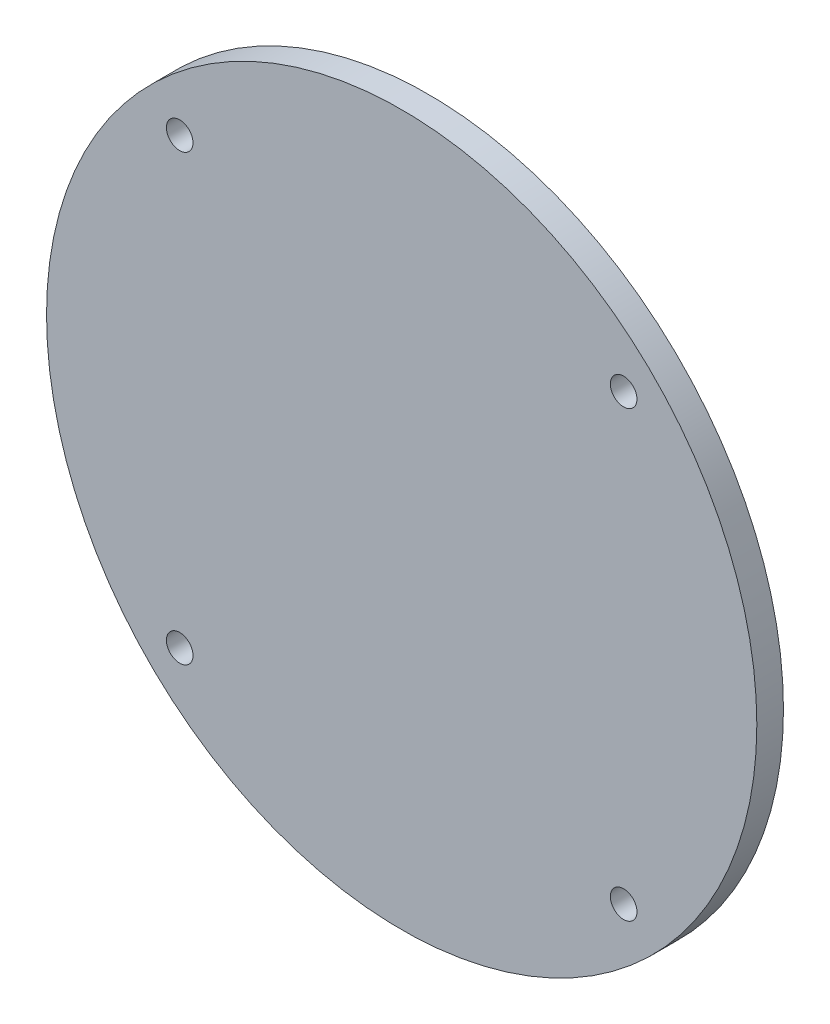
ISO-10303-21;
HEADER;
FILE_DESCRIPTION(('STEP AP214'),'2;1');
FILE_NAME('part.step','',(''),(''),'','','');
FILE_SCHEMA(('AUTOMOTIVE_DESIGN { 1 0 10303 214 1 1 1 1 }'));
ENDSEC;
DATA;
#1=APPLICATION_CONTEXT('core data for automotive mechanical design processes');
#2=APPLICATION_PROTOCOL_DEFINITION('international standard','automotive_design',2000,#1);
#3=PRODUCT_CONTEXT('',#1,'mechanical');
#4=PRODUCT('Part','Part','',(#3));
#5=PRODUCT_RELATED_PRODUCT_CATEGORY('part','',(#4));
#6=PRODUCT_DEFINITION_FORMATION('','',#4);
#7=PRODUCT_DEFINITION_CONTEXT('part definition',#1,'design');
#8=PRODUCT_DEFINITION('design','',#6,#7);
#9=PRODUCT_DEFINITION_SHAPE('','',#8);
#10=(LENGTH_UNIT() NAMED_UNIT(*) SI_UNIT(.MILLI.,.METRE.));
#11=(NAMED_UNIT(*) PLANE_ANGLE_UNIT() SI_UNIT($,.RADIAN.));
#12=(NAMED_UNIT(*) SI_UNIT($,.STERADIAN.) SOLID_ANGLE_UNIT());
#13=UNCERTAINTY_MEASURE_WITH_UNIT(LENGTH_MEASURE(1.E-05),#10,'distance_accuracy_value','');
#14=(GEOMETRIC_REPRESENTATION_CONTEXT(3) GLOBAL_UNCERTAINTY_ASSIGNED_CONTEXT((#13)) GLOBAL_UNIT_ASSIGNED_CONTEXT((#10,
#11,#12)) REPRESENTATION_CONTEXT('',''));
#15=CARTESIAN_POINT('',(0.,0.,0.));
#16=DIRECTION('',(0.,0.,1.));
#17=DIRECTION('',(1.,0.,0.));
#18=AXIS2_PLACEMENT_3D('',#15,#16,#17);
#19=CARTESIAN_POINT('',(25.,-25.,3.));
#20=DIRECTION('',(0.,0.,-1.));
#21=DIRECTION('',(-1.,0.,0.));
#22=AXIS2_PLACEMENT_3D('',#19,#20,#21);
#23=CYLINDRICAL_SURFACE('',#22,1.5);
#24=CARTESIAN_POINT('',(25.,-25.,3.));
#25=DIRECTION('',(0.,0.,1.));
#26=DIRECTION('',(1.,0.,0.));
#27=AXIS2_PLACEMENT_3D('',#24,#25,#26);
#28=CIRCLE('',#27,1.5);
#29=CARTESIAN_POINT('',(26.5,-25.,3.));
#30=VERTEX_POINT('',#29);
#31=EDGE_CURVE('E45',#30,#30,#28,.T.);
#32=ORIENTED_EDGE('',*,*,#31,.T.);
#33=EDGE_LOOP('',(#32));
#34=FACE_BOUND('',#33,.T.);
#35=CARTESIAN_POINT('',(25.,-25.,0.));
#36=DIRECTION('',(0.,0.,1.));
#37=DIRECTION('',(1.,0.,0.));
#38=AXIS2_PLACEMENT_3D('',#35,#36,#37);
#39=CIRCLE('',#38,1.5);
#40=CARTESIAN_POINT('',(26.5,-25.,0.));
#41=VERTEX_POINT('',#40);
#42=EDGE_CURVE('E62',#41,#41,#39,.T.);
#43=ORIENTED_EDGE('',*,*,#42,.F.);
#44=EDGE_LOOP('',(#43));
#45=FACE_BOUND('',#44,.T.);
#46=ADVANCED_FACE('F37',(#34,#45),#23,.F.);
#47=CARTESIAN_POINT('',(-25.,-25.,3.));
#48=DIRECTION('',(0.,0.,-1.));
#49=DIRECTION('',(-1.,0.,0.));
#50=AXIS2_PLACEMENT_3D('',#47,#48,#49);
#51=CYLINDRICAL_SURFACE('',#50,1.5);
#52=CARTESIAN_POINT('',(-25.,-25.,3.));
#53=DIRECTION('',(0.,0.,1.));
#54=DIRECTION('',(1.,0.,0.));
#55=AXIS2_PLACEMENT_3D('',#52,#53,#54);
#56=CIRCLE('',#55,1.5);
#57=CARTESIAN_POINT('',(-23.5,-25.,3.));
#58=VERTEX_POINT('',#57);
#59=EDGE_CURVE('E50',#58,#58,#56,.T.);
#60=ORIENTED_EDGE('',*,*,#59,.T.);
#61=EDGE_LOOP('',(#60));
#62=FACE_BOUND('',#61,.T.);
#63=CARTESIAN_POINT('',(-25.,-25.,0.));
#64=DIRECTION('',(0.,0.,1.));
#65=DIRECTION('',(1.,0.,0.));
#66=AXIS2_PLACEMENT_3D('',#63,#64,#65);
#67=CIRCLE('',#66,1.5);
#68=CARTESIAN_POINT('',(-23.5,-25.,0.));
#69=VERTEX_POINT('',#68);
#70=EDGE_CURVE('E60',#69,#69,#67,.T.);
#71=ORIENTED_EDGE('',*,*,#70,.F.);
#72=EDGE_LOOP('',(#71));
#73=FACE_BOUND('',#72,.T.);
#74=ADVANCED_FACE('F80',(#62,#73),#51,.F.);
#75=CARTESIAN_POINT('',(25.,25.,3.));
#76=DIRECTION('',(0.,0.,-1.));
#77=DIRECTION('',(-1.,0.,0.));
#78=AXIS2_PLACEMENT_3D('',#75,#76,#77);
#79=CYLINDRICAL_SURFACE('',#78,1.5);
#80=CARTESIAN_POINT('',(25.,25.,3.));
#81=DIRECTION('',(0.,0.,1.));
#82=DIRECTION('',(1.,0.,0.));
#83=AXIS2_PLACEMENT_3D('',#80,#81,#82);
#84=CIRCLE('',#83,1.5);
#85=CARTESIAN_POINT('',(26.5,25.,3.));
#86=VERTEX_POINT('',#85);
#87=EDGE_CURVE('E71',#86,#86,#84,.T.);
#88=ORIENTED_EDGE('',*,*,#87,.T.);
#89=EDGE_LOOP('',(#88));
#90=FACE_BOUND('',#89,.T.);
#91=CARTESIAN_POINT('',(25.,25.,0.));
#92=DIRECTION('',(0.,0.,1.));
#93=DIRECTION('',(1.,0.,0.));
#94=AXIS2_PLACEMENT_3D('',#91,#92,#93);
#95=CIRCLE('',#94,1.5);
#96=CARTESIAN_POINT('',(26.5,25.,0.));
#97=VERTEX_POINT('',#96);
#98=EDGE_CURVE('E57',#97,#97,#95,.T.);
#99=ORIENTED_EDGE('',*,*,#98,.F.);
#100=EDGE_LOOP('',(#99));
#101=FACE_BOUND('',#100,.T.);
#102=ADVANCED_FACE('F98',(#90,#101),#79,.F.);
#103=CARTESIAN_POINT('',(-25.,25.,3.));
#104=DIRECTION('',(0.,0.,-1.));
#105=DIRECTION('',(-1.,0.,0.));
#106=AXIS2_PLACEMENT_3D('',#103,#104,#105);
#107=CYLINDRICAL_SURFACE('',#106,1.5);
#108=CARTESIAN_POINT('',(-25.,25.,3.));
#109=DIRECTION('',(0.,0.,1.));
#110=DIRECTION('',(1.,0.,0.));
#111=AXIS2_PLACEMENT_3D('',#108,#109,#110);
#112=CIRCLE('',#111,1.5);
#113=CARTESIAN_POINT('',(-23.5,25.,3.));
#114=VERTEX_POINT('',#113);
#115=EDGE_CURVE('E67',#114,#114,#112,.T.);
#116=ORIENTED_EDGE('',*,*,#115,.T.);
#117=EDGE_LOOP('',(#116));
#118=FACE_BOUND('',#117,.T.);
#119=CARTESIAN_POINT('',(-25.,25.,0.));
#120=DIRECTION('',(0.,0.,1.));
#121=DIRECTION('',(1.,0.,0.));
#122=AXIS2_PLACEMENT_3D('',#119,#120,#121);
#123=CIRCLE('',#122,1.5);
#124=CARTESIAN_POINT('',(-23.5,25.,0.));
#125=VERTEX_POINT('',#124);
#126=EDGE_CURVE('E54',#125,#125,#123,.T.);
#127=ORIENTED_EDGE('',*,*,#126,.F.);
#128=EDGE_LOOP('',(#127));
#129=FACE_BOUND('',#128,.T.);
#130=ADVANCED_FACE('F39',(#118,#129),#107,.F.);
#131=CARTESIAN_POINT('',(0.,0.,3.));
#132=DIRECTION('',(0.,0.,-1.));
#133=DIRECTION('',(-1.,0.,0.));
#134=AXIS2_PLACEMENT_3D('',#131,#132,#133);
#135=CYLINDRICAL_SURFACE('',#134,40.);
#136=CARTESIAN_POINT('',(0.,0.,3.));
#137=DIRECTION('',(0.,0.,1.));
#138=DIRECTION('',(1.,0.,0.));
#139=AXIS2_PLACEMENT_3D('',#136,#137,#138);
#140=CIRCLE('',#139,40.);
#141=CARTESIAN_POINT('',(40.,0.,3.));
#142=VERTEX_POINT('',#141);
#143=EDGE_CURVE('E10',#142,#142,#140,.T.);
#144=ORIENTED_EDGE('',*,*,#143,.F.);
#145=EDGE_LOOP('',(#144));
#146=FACE_BOUND('',#145,.T.);
#147=CARTESIAN_POINT('',(0.,0.,0.));
#148=DIRECTION('',(0.,0.,1.));
#149=DIRECTION('',(1.,0.,0.));
#150=AXIS2_PLACEMENT_3D('',#147,#148,#149);
#151=CIRCLE('',#150,40.);
#152=CARTESIAN_POINT('',(40.,0.,0.));
#153=VERTEX_POINT('',#152);
#154=EDGE_CURVE('E41',#153,#153,#151,.T.);
#155=ORIENTED_EDGE('',*,*,#154,.T.);
#156=EDGE_LOOP('',(#155));
#157=FACE_BOUND('',#156,.T.);
#158=ADVANCED_FACE('F87',(#146,#157),#135,.T.);
#159=CARTESIAN_POINT('',(0.,0.,3.));
#160=DIRECTION('',(0.,0.,1.));
#161=DIRECTION('',(1.,0.,0.));
#162=AXIS2_PLACEMENT_3D('',#159,#160,#161);
#163=PLANE('',#162);
#164=ORIENTED_EDGE('',*,*,#115,.F.);
#165=EDGE_LOOP('',(#164));
#166=FACE_BOUND('',#165,.T.);
#167=ORIENTED_EDGE('',*,*,#87,.F.);
#168=EDGE_LOOP('',(#167));
#169=FACE_BOUND('',#168,.T.);
#170=ORIENTED_EDGE('',*,*,#59,.F.);
#171=EDGE_LOOP('',(#170));
#172=FACE_BOUND('',#171,.T.);
#173=ORIENTED_EDGE('',*,*,#31,.F.);
#174=EDGE_LOOP('',(#173));
#175=FACE_BOUND('',#174,.T.);
#176=ORIENTED_EDGE('',*,*,#143,.T.);
#177=EDGE_LOOP('',(#176));
#178=FACE_BOUND('',#177,.T.);
#179=ADVANCED_FACE('F83',(#166,#169,#172,#175,#178),#163,.T.);
#180=CARTESIAN_POINT('',(0.,0.,0.));
#181=DIRECTION('',(0.,0.,1.));
#182=DIRECTION('',(1.,0.,0.));
#183=AXIS2_PLACEMENT_3D('',#180,#181,#182);
#184=PLANE('',#183);
#185=ORIENTED_EDGE('',*,*,#126,.T.);
#186=EDGE_LOOP('',(#185));
#187=FACE_BOUND('',#186,.T.);
#188=ORIENTED_EDGE('',*,*,#98,.T.);
#189=EDGE_LOOP('',(#188));
#190=FACE_BOUND('',#189,.T.);
#191=ORIENTED_EDGE('',*,*,#70,.T.);
#192=EDGE_LOOP('',(#191));
#193=FACE_BOUND('',#192,.T.);
#194=ORIENTED_EDGE('',*,*,#42,.T.);
#195=EDGE_LOOP('',(#194));
#196=FACE_BOUND('',#195,.T.);
#197=ORIENTED_EDGE('',*,*,#154,.F.);
#198=EDGE_LOOP('',(#197));
#199=FACE_BOUND('',#198,.T.);
#200=ADVANCED_FACE('F86',(#187,#190,#193,#196,#199),#184,.F.);
#201=CLOSED_SHELL('',(#46,#74,#102,#130,#158,#179,#200));
#202=MANIFOLD_SOLID_BREP('B2',#201);
#203=ADVANCED_BREP_SHAPE_REPRESENTATION('',(#18,#202),#14);
#204=SHAPE_DEFINITION_REPRESENTATION(#9,#203);
ENDSEC;
END-ISO-10303-21;
